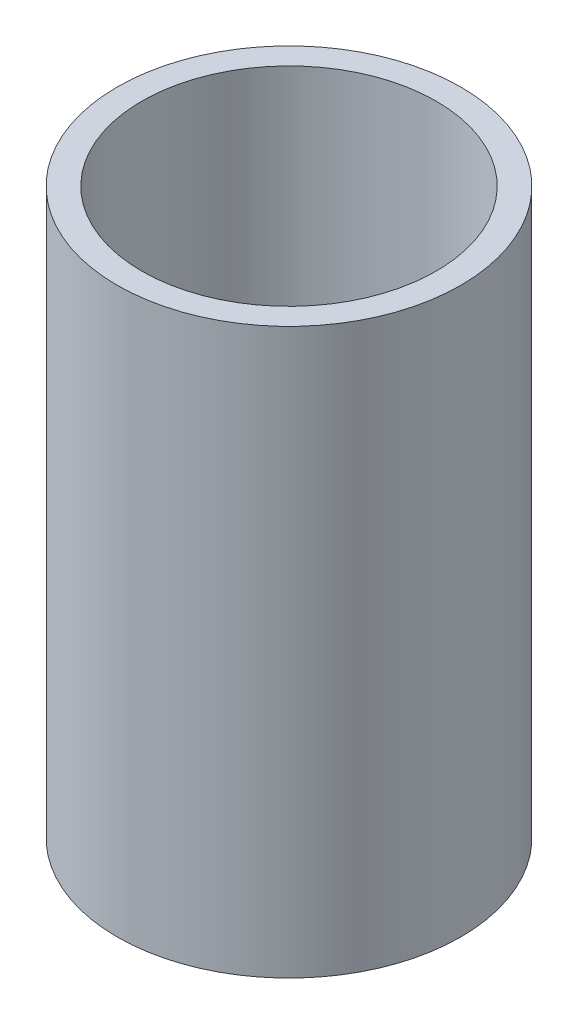
ISO-10303-21;
HEADER;
FILE_DESCRIPTION(('STEP AP214'),'2;1');
FILE_NAME('part.step','',(''),(''),'','','');
FILE_SCHEMA(('AUTOMOTIVE_DESIGN { 1 0 10303 214 1 1 1 1 }'));
ENDSEC;
DATA;
#1=APPLICATION_CONTEXT('core data for automotive mechanical design processes');
#2=APPLICATION_PROTOCOL_DEFINITION('international standard','automotive_design',2000,#1);
#3=PRODUCT_CONTEXT('',#1,'mechanical');
#4=PRODUCT('Part','Part','',(#3));
#5=PRODUCT_RELATED_PRODUCT_CATEGORY('part','',(#4));
#6=PRODUCT_DEFINITION_FORMATION('','',#4);
#7=PRODUCT_DEFINITION_CONTEXT('part definition',#1,'design');
#8=PRODUCT_DEFINITION('design','',#6,#7);
#9=PRODUCT_DEFINITION_SHAPE('','',#8);
#10=(LENGTH_UNIT() NAMED_UNIT(*) SI_UNIT(.MILLI.,.METRE.));
#11=(NAMED_UNIT(*) PLANE_ANGLE_UNIT() SI_UNIT($,.RADIAN.));
#12=(NAMED_UNIT(*) SI_UNIT($,.STERADIAN.) SOLID_ANGLE_UNIT());
#13=UNCERTAINTY_MEASURE_WITH_UNIT(LENGTH_MEASURE(1.E-05),#10,'distance_accuracy_value','');
#14=(GEOMETRIC_REPRESENTATION_CONTEXT(3) GLOBAL_UNCERTAINTY_ASSIGNED_CONTEXT((#13)) GLOBAL_UNIT_ASSIGNED_CONTEXT((#10,
#11,#12)) REPRESENTATION_CONTEXT('',''));
#15=CARTESIAN_POINT('',(0.,0.,0.));
#16=DIRECTION('',(0.,0.,1.));
#17=DIRECTION('',(1.,0.,0.));
#18=AXIS2_PLACEMENT_3D('',#15,#16,#17);
#19=CARTESIAN_POINT('',(0.,11.5,0.));
#20=DIRECTION('',(0.,1.,0.));
#21=DIRECTION('',(0.,0.,1.));
#22=AXIS2_PLACEMENT_3D('',#19,#20,#21);
#23=PLANE('',#22);
#24=CARTESIAN_POINT('',(0.,11.5,0.));
#25=DIRECTION('',(0.,1.,0.));
#26=DIRECTION('',(0.,0.,1.));
#27=AXIS2_PLACEMENT_3D('',#24,#25,#26);
#28=CIRCLE('',#27,3.5);
#29=CARTESIAN_POINT('',(0.,11.5,3.5));
#30=VERTEX_POINT('',#29);
#31=EDGE_CURVE('E10',#30,#30,#28,.T.);
#32=ORIENTED_EDGE('',*,*,#31,.T.);
#33=EDGE_LOOP('',(#32));
#34=FACE_BOUND('',#33,.T.);
#35=CARTESIAN_POINT('',(0.,11.5,0.));
#36=DIRECTION('',(0.,1.,0.));
#37=DIRECTION('',(0.,0.,1.));
#38=AXIS2_PLACEMENT_3D('',#35,#36,#37);
#39=CIRCLE('',#38,3.);
#40=CARTESIAN_POINT('',(0.,11.5,3.));
#41=VERTEX_POINT('',#40);
#42=EDGE_CURVE('E50',#41,#41,#39,.T.);
#43=ORIENTED_EDGE('',*,*,#42,.F.);
#44=EDGE_LOOP('',(#43));
#45=FACE_BOUND('',#44,.T.);
#46=ADVANCED_FACE('F37',(#34,#45),#23,.T.);
#47=CARTESIAN_POINT('',(0.,0.,0.));
#48=DIRECTION('',(0.,1.,0.));
#49=DIRECTION('',(0.,0.,1.));
#50=AXIS2_PLACEMENT_3D('',#47,#48,#49);
#51=PLANE('',#50);
#52=CARTESIAN_POINT('',(0.,0.,0.));
#53=DIRECTION('',(0.,1.,0.));
#54=DIRECTION('',(0.,0.,1.));
#55=AXIS2_PLACEMENT_3D('',#52,#53,#54);
#56=CIRCLE('',#55,3.5);
#57=CARTESIAN_POINT('',(0.,0.,3.5));
#58=VERTEX_POINT('',#57);
#59=EDGE_CURVE('E41',#58,#58,#56,.T.);
#60=ORIENTED_EDGE('',*,*,#59,.F.);
#61=EDGE_LOOP('',(#60));
#62=FACE_BOUND('',#61,.T.);
#63=CARTESIAN_POINT('',(0.,0.,0.));
#64=DIRECTION('',(0.,1.,0.));
#65=DIRECTION('',(0.,0.,1.));
#66=AXIS2_PLACEMENT_3D('',#63,#64,#65);
#67=CIRCLE('',#66,3.);
#68=CARTESIAN_POINT('',(0.,0.,3.));
#69=VERTEX_POINT('',#68);
#70=EDGE_CURVE('E52',#69,#69,#67,.T.);
#71=ORIENTED_EDGE('',*,*,#70,.T.);
#72=EDGE_LOOP('',(#71));
#73=FACE_BOUND('',#72,.T.);
#74=ADVANCED_FACE('F64',(#62,#73),#51,.F.);
#75=CARTESIAN_POINT('',(0.,11.5,0.));
#76=DIRECTION('',(0.,-1.,0.));
#77=DIRECTION('',(0.,0.,-1.));
#78=AXIS2_PLACEMENT_3D('',#75,#76,#77);
#79=CYLINDRICAL_SURFACE('',#78,3.5);
#80=ORIENTED_EDGE('',*,*,#31,.F.);
#81=EDGE_LOOP('',(#80));
#82=FACE_BOUND('',#81,.T.);
#83=ORIENTED_EDGE('',*,*,#59,.T.);
#84=EDGE_LOOP('',(#83));
#85=FACE_BOUND('',#84,.T.);
#86=ADVANCED_FACE('F39',(#82,#85),#79,.T.);
#87=CARTESIAN_POINT('',(0.,11.5,0.));
#88=DIRECTION('',(0.,-1.,0.));
#89=DIRECTION('',(0.,0.,-1.));
#90=AXIS2_PLACEMENT_3D('',#87,#88,#89);
#91=CYLINDRICAL_SURFACE('',#90,3.);
#92=ORIENTED_EDGE('',*,*,#42,.T.);
#93=EDGE_LOOP('',(#92));
#94=FACE_BOUND('',#93,.T.);
#95=ORIENTED_EDGE('',*,*,#70,.F.);
#96=EDGE_LOOP('',(#95));
#97=FACE_BOUND('',#96,.T.);
#98=ADVANCED_FACE('F60',(#94,#97),#91,.F.);
#99=CLOSED_SHELL('',(#46,#74,#86,#98));
#100=MANIFOLD_SOLID_BREP('B2',#99);
#101=ADVANCED_BREP_SHAPE_REPRESENTATION('',(#18,#100),#14);
#102=SHAPE_DEFINITION_REPRESENTATION(#9,#101);
ENDSEC;
END-ISO-10303-21;
